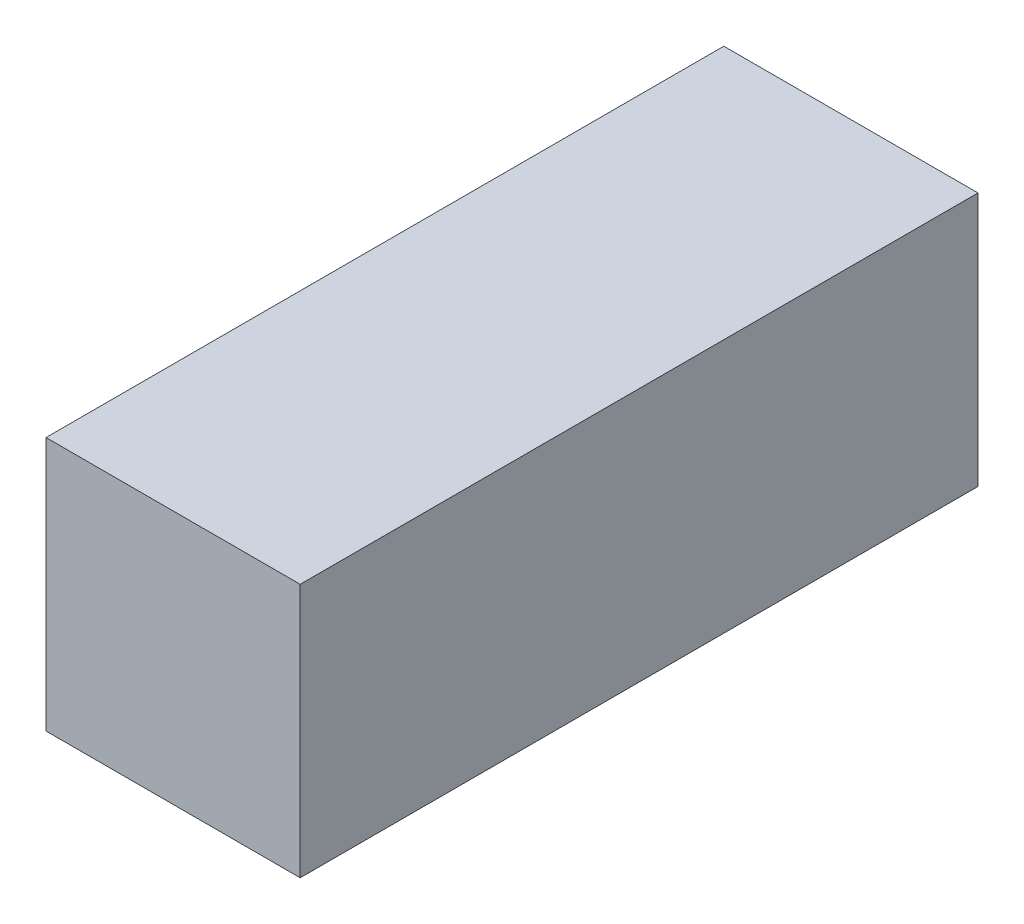
ISO-10303-21;
HEADER;
FILE_DESCRIPTION(('STEP AP214'),'2;1');
FILE_NAME('part.step','',(''),(''),'','','');
FILE_SCHEMA(('AUTOMOTIVE_DESIGN { 1 0 10303 214 1 1 1 1 }'));
ENDSEC;
DATA;
#1=APPLICATION_CONTEXT('core data for automotive mechanical design processes');
#2=APPLICATION_PROTOCOL_DEFINITION('international standard','automotive_design',2000,#1);
#3=PRODUCT_CONTEXT('',#1,'mechanical');
#4=PRODUCT('Part','Part','',(#3));
#5=PRODUCT_RELATED_PRODUCT_CATEGORY('part','',(#4));
#6=PRODUCT_DEFINITION_FORMATION('','',#4);
#7=PRODUCT_DEFINITION_CONTEXT('part definition',#1,'design');
#8=PRODUCT_DEFINITION('design','',#6,#7);
#9=PRODUCT_DEFINITION_SHAPE('','',#8);
#10=(LENGTH_UNIT() NAMED_UNIT(*) SI_UNIT(.MILLI.,.METRE.));
#11=(NAMED_UNIT(*) PLANE_ANGLE_UNIT() SI_UNIT($,.RADIAN.));
#12=(NAMED_UNIT(*) SI_UNIT($,.STERADIAN.) SOLID_ANGLE_UNIT());
#13=UNCERTAINTY_MEASURE_WITH_UNIT(LENGTH_MEASURE(1.E-05),#10,'distance_accuracy_value','');
#14=(GEOMETRIC_REPRESENTATION_CONTEXT(3) GLOBAL_UNCERTAINTY_ASSIGNED_CONTEXT((#13)) GLOBAL_UNIT_ASSIGNED_CONTEXT((#10,
#11,#12)) REPRESENTATION_CONTEXT('',''));
#15=CARTESIAN_POINT('',(0.,0.,0.));
#16=DIRECTION('',(0.,0.,1.));
#17=DIRECTION('',(1.,0.,0.));
#18=AXIS2_PLACEMENT_3D('',#15,#16,#17);
#19=CARTESIAN_POINT('',(0.,0.,101.6));
#20=DIRECTION('',(1.,0.,0.));
#21=DIRECTION('',(0.,0.,-1.));
#22=AXIS2_PLACEMENT_3D('',#19,#20,#21);
#23=PLANE('',#22);
#24=DIRECTION('',(0.,-1.,0.));
#25=VECTOR('',#24,1.);
#26=CARTESIAN_POINT('',(0.,0.,0.));
#27=LINE('',#26,#25);
#28=CARTESIAN_POINT('',(0.,38.1,0.));
#29=VERTEX_POINT('',#28);
#30=CARTESIAN_POINT('',(0.,0.,0.));
#31=VERTEX_POINT('',#30);
#32=EDGE_CURVE('E107',#29,#31,#27,.T.);
#33=ORIENTED_EDGE('',*,*,#32,.T.);
#34=DIRECTION('',(0.,0.,-1.));
#35=VECTOR('',#34,1.);
#36=CARTESIAN_POINT('',(0.,0.,101.6));
#37=LINE('',#36,#35);
#38=CARTESIAN_POINT('',(0.,0.,101.6));
#39=VERTEX_POINT('',#38);
#40=EDGE_CURVE('E11',#39,#31,#37,.T.);
#41=ORIENTED_EDGE('',*,*,#40,.F.);
#42=DIRECTION('',(0.,-1.,0.));
#43=VECTOR('',#42,1.);
#44=CARTESIAN_POINT('',(0.,0.,101.6));
#45=LINE('',#44,#43);
#46=CARTESIAN_POINT('',(0.,38.1,101.6));
#47=VERTEX_POINT('',#46);
#48=EDGE_CURVE('E91',#47,#39,#45,.T.);
#49=ORIENTED_EDGE('',*,*,#48,.F.);
#50=DIRECTION('',(0.,0.,-1.));
#51=VECTOR('',#50,1.);
#52=CARTESIAN_POINT('',(0.,38.1,101.6));
#53=LINE('',#52,#51);
#54=EDGE_CURVE('E103',#47,#29,#53,.T.);
#55=ORIENTED_EDGE('',*,*,#54,.T.);
#56=EDGE_LOOP('',(#33,#41,#49,#55));
#57=FACE_BOUND('',#56,.T.);
#58=ADVANCED_FACE('F39',(#57),#23,.F.);
#59=CARTESIAN_POINT('',(0.,0.,101.6));
#60=DIRECTION('',(0.,1.,0.));
#61=DIRECTION('',(0.,0.,1.));
#62=AXIS2_PLACEMENT_3D('',#59,#60,#61);
#63=PLANE('',#62);
#64=DIRECTION('',(1.,0.,0.));
#65=VECTOR('',#64,1.);
#66=CARTESIAN_POINT('',(0.,0.,0.));
#67=LINE('',#66,#65);
#68=CARTESIAN_POINT('',(38.1,0.,0.));
#69=VERTEX_POINT('',#68);
#70=EDGE_CURVE('E96',#31,#69,#67,.T.);
#71=ORIENTED_EDGE('',*,*,#70,.T.);
#72=DIRECTION('',(0.,0.,-1.));
#73=VECTOR('',#72,1.);
#74=CARTESIAN_POINT('',(38.1,0.,101.6));
#75=LINE('',#74,#73);
#76=CARTESIAN_POINT('',(38.1,0.,101.6));
#77=VERTEX_POINT('',#76);
#78=EDGE_CURVE('E48',#77,#69,#75,.T.);
#79=ORIENTED_EDGE('',*,*,#78,.F.);
#80=DIRECTION('',(1.,0.,0.));
#81=VECTOR('',#80,1.);
#82=CARTESIAN_POINT('',(0.,0.,101.6));
#83=LINE('',#82,#81);
#84=EDGE_CURVE('E86',#39,#77,#83,.T.);
#85=ORIENTED_EDGE('',*,*,#84,.F.);
#86=ORIENTED_EDGE('',*,*,#40,.T.);
#87=EDGE_LOOP('',(#71,#79,#85,#86));
#88=FACE_BOUND('',#87,.T.);
#89=ADVANCED_FACE('F95',(#88),#63,.F.);
#90=CARTESIAN_POINT('',(38.1,0.,101.6));
#91=DIRECTION('',(-1.,0.,0.));
#92=DIRECTION('',(0.,0.,1.));
#93=AXIS2_PLACEMENT_3D('',#90,#91,#92);
#94=PLANE('',#93);
#95=DIRECTION('',(0.,1.,0.));
#96=VECTOR('',#95,1.);
#97=CARTESIAN_POINT('',(38.1,0.,0.));
#98=LINE('',#97,#96);
#99=CARTESIAN_POINT('',(38.1,38.1,0.));
#100=VERTEX_POINT('',#99);
#101=EDGE_CURVE('E73',#69,#100,#98,.T.);
#102=ORIENTED_EDGE('',*,*,#101,.T.);
#103=DIRECTION('',(0.,0.,-1.));
#104=VECTOR('',#103,1.);
#105=CARTESIAN_POINT('',(38.1,38.1,101.6));
#106=LINE('',#105,#104);
#107=CARTESIAN_POINT('',(38.1,38.1,101.6));
#108=VERTEX_POINT('',#107);
#109=EDGE_CURVE('E98',#108,#100,#106,.T.);
#110=ORIENTED_EDGE('',*,*,#109,.F.);
#111=DIRECTION('',(0.,1.,0.));
#112=VECTOR('',#111,1.);
#113=CARTESIAN_POINT('',(38.1,0.,101.6));
#114=LINE('',#113,#112);
#115=EDGE_CURVE('E89',#77,#108,#114,.T.);
#116=ORIENTED_EDGE('',*,*,#115,.F.);
#117=ORIENTED_EDGE('',*,*,#78,.T.);
#118=EDGE_LOOP('',(#102,#110,#116,#117));
#119=FACE_BOUND('',#118,.T.);
#120=ADVANCED_FACE('F99',(#119),#94,.F.);
#121=CARTESIAN_POINT('',(0.,38.1,101.6));
#122=DIRECTION('',(0.,-1.,0.));
#123=DIRECTION('',(0.,0.,-1.));
#124=AXIS2_PLACEMENT_3D('',#121,#122,#123);
#125=PLANE('',#124);
#126=DIRECTION('',(-1.,0.,0.));
#127=VECTOR('',#126,1.);
#128=CARTESIAN_POINT('',(0.,38.1,0.));
#129=LINE('',#128,#127);
#130=EDGE_CURVE('E79',#100,#29,#129,.T.);
#131=ORIENTED_EDGE('',*,*,#130,.T.);
#132=ORIENTED_EDGE('',*,*,#54,.F.);
#133=DIRECTION('',(-1.,0.,0.));
#134=VECTOR('',#133,1.);
#135=CARTESIAN_POINT('',(0.,38.1,101.6));
#136=LINE('',#135,#134);
#137=EDGE_CURVE('E56',#108,#47,#136,.T.);
#138=ORIENTED_EDGE('',*,*,#137,.F.);
#139=ORIENTED_EDGE('',*,*,#109,.T.);
#140=EDGE_LOOP('',(#131,#132,#138,#139));
#141=FACE_BOUND('',#140,.T.);
#142=ADVANCED_FACE('F120',(#141),#125,.F.);
#143=CARTESIAN_POINT('',(0.,0.,101.6));
#144=DIRECTION('',(0.,0.,-1.));
#145=DIRECTION('',(-1.,0.,0.));
#146=AXIS2_PLACEMENT_3D('',#143,#144,#145);
#147=PLANE('',#146);
#148=ORIENTED_EDGE('',*,*,#48,.T.);
#149=ORIENTED_EDGE('',*,*,#84,.T.);
#150=ORIENTED_EDGE('',*,*,#115,.T.);
#151=ORIENTED_EDGE('',*,*,#137,.T.);
#152=EDGE_LOOP('',(#148,#149,#150,#151));
#153=FACE_BOUND('',#152,.T.);
#154=ADVANCED_FACE('F87',(#153),#147,.F.);
#155=CARTESIAN_POINT('',(0.,0.,0.));
#156=DIRECTION('',(0.,0.,-1.));
#157=DIRECTION('',(-1.,0.,0.));
#158=AXIS2_PLACEMENT_3D('',#155,#156,#157);
#159=PLANE('',#158);
#160=ORIENTED_EDGE('',*,*,#32,.F.);
#161=ORIENTED_EDGE('',*,*,#130,.F.);
#162=ORIENTED_EDGE('',*,*,#101,.F.);
#163=ORIENTED_EDGE('',*,*,#70,.F.);
#164=EDGE_LOOP('',(#160,#161,#162,#163));
#165=FACE_BOUND('',#164,.T.);
#166=ADVANCED_FACE('F123',(#165),#159,.T.);
#167=CLOSED_SHELL('',(#58,#89,#120,#142,#154,#166));
#168=MANIFOLD_SOLID_BREP('B2',#167);
#169=ADVANCED_BREP_SHAPE_REPRESENTATION('',(#18,#168),#14);
#170=SHAPE_DEFINITION_REPRESENTATION(#9,#169);
ENDSEC;
END-ISO-10303-21;
